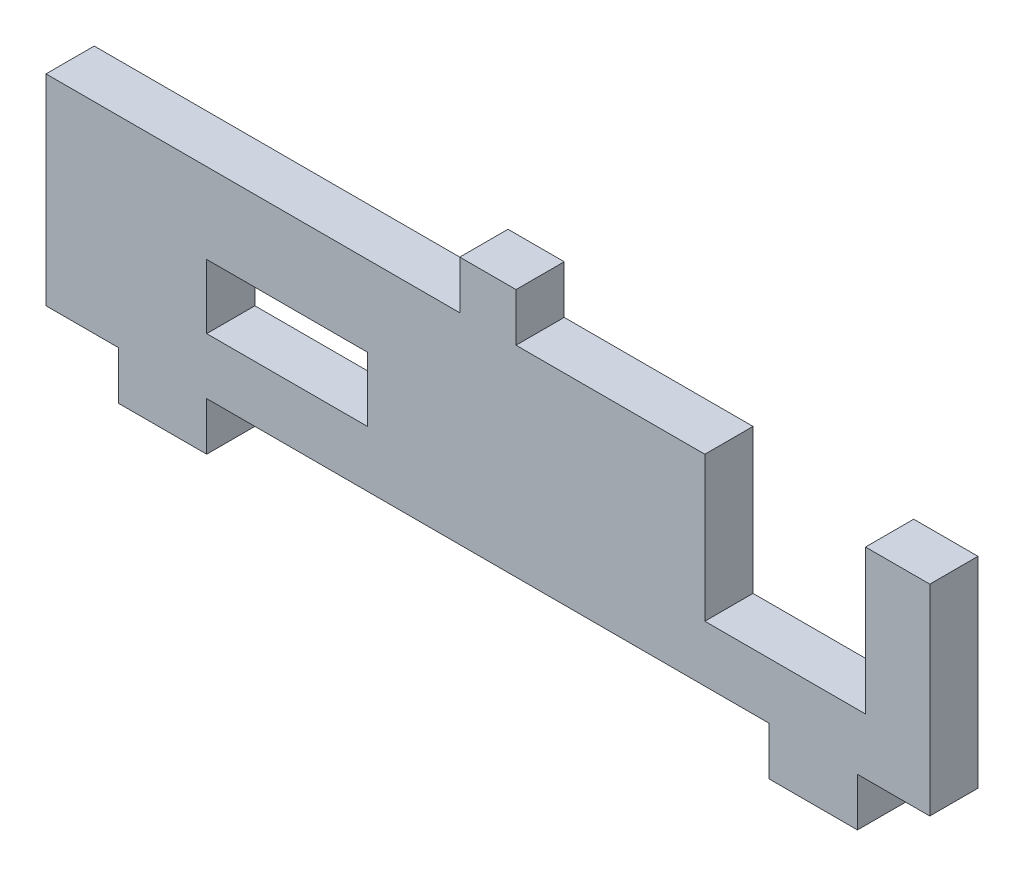
ISO-10303-21;
HEADER;
FILE_DESCRIPTION(('STEP AP214'),'2;1');
FILE_NAME('part.step','',(''),(''),'','','');
FILE_SCHEMA(('AUTOMOTIVE_DESIGN { 1 0 10303 214 1 1 1 1 }'));
ENDSEC;
DATA;
#1=APPLICATION_CONTEXT('core data for automotive mechanical design processes');
#2=APPLICATION_PROTOCOL_DEFINITION('international standard','automotive_design',2000,#1);
#3=PRODUCT_CONTEXT('',#1,'mechanical');
#4=PRODUCT('Part','Part','',(#3));
#5=PRODUCT_RELATED_PRODUCT_CATEGORY('part','',(#4));
#6=PRODUCT_DEFINITION_FORMATION('','',#4);
#7=PRODUCT_DEFINITION_CONTEXT('part definition',#1,'design');
#8=PRODUCT_DEFINITION('design','',#6,#7);
#9=PRODUCT_DEFINITION_SHAPE('','',#8);
#10=(LENGTH_UNIT() NAMED_UNIT(*) SI_UNIT(.MILLI.,.METRE.));
#11=(NAMED_UNIT(*) PLANE_ANGLE_UNIT() SI_UNIT($,.RADIAN.));
#12=(NAMED_UNIT(*) SI_UNIT($,.STERADIAN.) SOLID_ANGLE_UNIT());
#13=UNCERTAINTY_MEASURE_WITH_UNIT(LENGTH_MEASURE(1.E-05),#10,'distance_accuracy_value','');
#14=(GEOMETRIC_REPRESENTATION_CONTEXT(3) GLOBAL_UNCERTAINTY_ASSIGNED_CONTEXT((#13)) GLOBAL_UNIT_ASSIGNED_CONTEXT((#10,
#11,#12)) REPRESENTATION_CONTEXT('',''));
#15=CARTESIAN_POINT('',(0.,0.,0.));
#16=DIRECTION('',(0.,0.,1.));
#17=DIRECTION('',(1.,0.,0.));
#18=AXIS2_PLACEMENT_3D('',#15,#16,#17);
#19=CARTESIAN_POINT('',(0.,0.,3.));
#20=DIRECTION('',(0.,0.,1.));
#21=DIRECTION('',(1.,0.,0.));
#22=AXIS2_PLACEMENT_3D('',#19,#20,#21);
#23=PLANE('',#22);
#24=DIRECTION('',(-1.,0.,0.));
#25=VECTOR('',#24,1.);
#26=CARTESIAN_POINT('',(23.5,6.25,3.));
#27=LINE('',#26,#25);
#28=CARTESIAN_POINT('',(27.5,6.25,3.));
#29=VERTEX_POINT('',#28);
#30=CARTESIAN_POINT('',(23.5,6.25,3.));
#31=VERTEX_POINT('',#30);
#32=EDGE_CURVE('E230',#29,#31,#27,.T.);
#33=ORIENTED_EDGE('',*,*,#32,.T.);
#34=DIRECTION('',(0.,-1.,0.));
#35=VECTOR('',#34,1.);
#36=CARTESIAN_POINT('',(23.5,6.25,3.));
#37=LINE('',#36,#35);
#38=CARTESIAN_POINT('',(23.5,-2.75,3.));
#39=VERTEX_POINT('',#38);
#40=EDGE_CURVE('E233',#31,#39,#37,.T.);
#41=ORIENTED_EDGE('',*,*,#40,.T.);
#42=DIRECTION('',(-1.,0.,0.));
#43=VECTOR('',#42,1.);
#44=CARTESIAN_POINT('',(13.5,-2.75,3.));
#45=LINE('',#44,#43);
#46=CARTESIAN_POINT('',(13.5,-2.75,3.));
#47=VERTEX_POINT('',#46);
#48=EDGE_CURVE('E236',#39,#47,#45,.T.);
#49=ORIENTED_EDGE('',*,*,#48,.T.);
#50=DIRECTION('',(0.,1.,0.));
#51=VECTOR('',#50,1.);
#52=CARTESIAN_POINT('',(13.5,6.25,3.));
#53=LINE('',#52,#51);
#54=CARTESIAN_POINT('',(13.5,6.25,3.));
#55=VERTEX_POINT('',#54);
#56=EDGE_CURVE('E238',#47,#55,#53,.T.);
#57=ORIENTED_EDGE('',*,*,#56,.T.);
#58=DIRECTION('',(-1.,0.,0.));
#59=VECTOR('',#58,1.);
#60=CARTESIAN_POINT('',(1.75,6.25,3.));
#61=LINE('',#60,#59);
#62=CARTESIAN_POINT('',(1.75,6.25,3.));
#63=VERTEX_POINT('',#62);
#64=EDGE_CURVE('E240',#55,#63,#61,.T.);
#65=ORIENTED_EDGE('',*,*,#64,.T.);
#66=DIRECTION('',(0.,1.,0.));
#67=VECTOR('',#66,1.);
#68=CARTESIAN_POINT('',(1.75,6.25,3.));
#69=LINE('',#68,#67);
#70=CARTESIAN_POINT('',(1.75,9.25,3.));
#71=VERTEX_POINT('',#70);
#72=EDGE_CURVE('E242',#63,#71,#69,.T.);
#73=ORIENTED_EDGE('',*,*,#72,.T.);
#74=DIRECTION('',(-1.,0.,0.));
#75=VECTOR('',#74,1.);
#76=CARTESIAN_POINT('',(-1.75,9.25,3.));
#77=LINE('',#76,#75);
#78=CARTESIAN_POINT('',(-1.75,9.25,3.));
#79=VERTEX_POINT('',#78);
#80=EDGE_CURVE('E244',#71,#79,#77,.T.);
#81=ORIENTED_EDGE('',*,*,#80,.T.);
#82=DIRECTION('',(0.,-1.,0.));
#83=VECTOR('',#82,1.);
#84=CARTESIAN_POINT('',(-1.75,6.25,3.));
#85=LINE('',#84,#83);
#86=CARTESIAN_POINT('',(-1.75,6.25,3.));
#87=VERTEX_POINT('',#86);
#88=EDGE_CURVE('E246',#79,#87,#85,.T.);
#89=ORIENTED_EDGE('',*,*,#88,.T.);
#90=DIRECTION('',(-1.,0.,0.));
#91=VECTOR('',#90,1.);
#92=CARTESIAN_POINT('',(-27.5,6.25,3.));
#93=LINE('',#92,#91);
#94=CARTESIAN_POINT('',(-27.5,6.25,3.));
#95=VERTEX_POINT('',#94);
#96=EDGE_CURVE('E248',#87,#95,#93,.T.);
#97=ORIENTED_EDGE('',*,*,#96,.T.);
#98=DIRECTION('',(0.,-1.,0.));
#99=VECTOR('',#98,1.);
#100=CARTESIAN_POINT('',(-27.5,-6.25,3.));
#101=LINE('',#100,#99);
#102=CARTESIAN_POINT('',(-27.5,-6.25,3.));
#103=VERTEX_POINT('',#102);
#104=EDGE_CURVE('E250',#95,#103,#101,.T.);
#105=ORIENTED_EDGE('',*,*,#104,.T.);
#106=DIRECTION('',(1.,0.,0.));
#107=VECTOR('',#106,1.);
#108=CARTESIAN_POINT('',(-27.5,-6.25,3.));
#109=LINE('',#108,#107);
#110=CARTESIAN_POINT('',(-23.,-6.25,3.));
#111=VERTEX_POINT('',#110);
#112=EDGE_CURVE('E252',#103,#111,#109,.T.);
#113=ORIENTED_EDGE('',*,*,#112,.T.);
#114=DIRECTION('',(0.,-1.,0.));
#115=VECTOR('',#114,1.);
#116=CARTESIAN_POINT('',(-23.,-6.25,3.));
#117=LINE('',#116,#115);
#118=CARTESIAN_POINT('',(-23.,-9.25,3.));
#119=VERTEX_POINT('',#118);
#120=EDGE_CURVE('E254',#111,#119,#117,.T.);
#121=ORIENTED_EDGE('',*,*,#120,.T.);
#122=DIRECTION('',(1.,0.,0.));
#123=VECTOR('',#122,1.);
#124=CARTESIAN_POINT('',(-23.,-9.25,3.));
#125=LINE('',#124,#123);
#126=CARTESIAN_POINT('',(-17.5,-9.25,3.));
#127=VERTEX_POINT('',#126);
#128=EDGE_CURVE('E256',#119,#127,#125,.T.);
#129=ORIENTED_EDGE('',*,*,#128,.T.);
#130=DIRECTION('',(0.,1.,0.));
#131=VECTOR('',#130,1.);
#132=CARTESIAN_POINT('',(-17.5,-6.25,3.));
#133=LINE('',#132,#131);
#134=CARTESIAN_POINT('',(-17.5,-6.25,3.));
#135=VERTEX_POINT('',#134);
#136=EDGE_CURVE('E258',#127,#135,#133,.T.);
#137=ORIENTED_EDGE('',*,*,#136,.T.);
#138=DIRECTION('',(1.,0.,0.));
#139=VECTOR('',#138,1.);
#140=CARTESIAN_POINT('',(-17.5,-6.25,3.));
#141=LINE('',#140,#139);
#142=CARTESIAN_POINT('',(17.5,-6.25,3.));
#143=VERTEX_POINT('',#142);
#144=EDGE_CURVE('E260',#135,#143,#141,.T.);
#145=ORIENTED_EDGE('',*,*,#144,.T.);
#146=DIRECTION('',(0.,-1.,0.));
#147=VECTOR('',#146,1.);
#148=CARTESIAN_POINT('',(17.5,-6.25,3.));
#149=LINE('',#148,#147);
#150=CARTESIAN_POINT('',(17.5,-9.25,3.));
#151=VERTEX_POINT('',#150);
#152=EDGE_CURVE('E262',#143,#151,#149,.T.);
#153=ORIENTED_EDGE('',*,*,#152,.T.);
#154=DIRECTION('',(1.,0.,0.));
#155=VECTOR('',#154,1.);
#156=CARTESIAN_POINT('',(17.5,-9.25,3.));
#157=LINE('',#156,#155);
#158=CARTESIAN_POINT('',(23.,-9.25,3.));
#159=VERTEX_POINT('',#158);
#160=EDGE_CURVE('E264',#151,#159,#157,.T.);
#161=ORIENTED_EDGE('',*,*,#160,.T.);
#162=DIRECTION('',(0.,1.,0.));
#163=VECTOR('',#162,1.);
#164=CARTESIAN_POINT('',(23.,-6.25,3.));
#165=LINE('',#164,#163);
#166=CARTESIAN_POINT('',(23.,-6.25,3.));
#167=VERTEX_POINT('',#166);
#168=EDGE_CURVE('E266',#159,#167,#165,.T.);
#169=ORIENTED_EDGE('',*,*,#168,.T.);
#170=DIRECTION('',(1.,0.,0.));
#171=VECTOR('',#170,1.);
#172=CARTESIAN_POINT('',(23.,-6.25,3.));
#173=LINE('',#172,#171);
#174=CARTESIAN_POINT('',(27.5,-6.25,3.));
#175=VERTEX_POINT('',#174);
#176=EDGE_CURVE('E268',#167,#175,#173,.T.);
#177=ORIENTED_EDGE('',*,*,#176,.T.);
#178=DIRECTION('',(0.,1.,0.));
#179=VECTOR('',#178,1.);
#180=CARTESIAN_POINT('',(27.5,-6.25,3.));
#181=LINE('',#180,#179);
#182=EDGE_CURVE('E270',#175,#29,#181,.T.);
#183=ORIENTED_EDGE('',*,*,#182,.T.);
#184=EDGE_LOOP('',(#33,#41,#49,#57,#65,#73,#81,#89,#97,#105,#113,#121,#129,#137,#145,#153,#161,
#169,#177,#183));
#185=FACE_BOUND('',#184,.T.);
#186=DIRECTION('',(1.,0.,0.));
#187=VECTOR('',#186,1.);
#188=CARTESIAN_POINT('',(-17.5,-2.75,3.));
#189=LINE('',#188,#187);
#190=CARTESIAN_POINT('',(-17.5,-2.75,3.));
#191=VERTEX_POINT('',#190);
#192=CARTESIAN_POINT('',(-7.49999999999999,-2.75,3.));
#193=VERTEX_POINT('',#192);
#194=EDGE_CURVE('E202',#191,#193,#189,.T.);
#195=ORIENTED_EDGE('',*,*,#194,.F.);
#196=DIRECTION('',(0.,-1.,0.));
#197=VECTOR('',#196,1.);
#198=CARTESIAN_POINT('',(-17.5,1.25,3.));
#199=LINE('',#198,#197);
#200=CARTESIAN_POINT('',(-17.5,1.25,3.));
#201=VERTEX_POINT('',#200);
#202=EDGE_CURVE('E194',#201,#191,#199,.T.);
#203=ORIENTED_EDGE('',*,*,#202,.F.);
#204=DIRECTION('',(-1.,0.,0.));
#205=VECTOR('',#204,1.);
#206=CARTESIAN_POINT('',(-17.5,1.25,3.));
#207=LINE('',#206,#205);
#208=CARTESIAN_POINT('',(-7.49999999999999,1.25,3.));
#209=VERTEX_POINT('',#208);
#210=EDGE_CURVE('E216',#209,#201,#207,.T.);
#211=ORIENTED_EDGE('',*,*,#210,.F.);
#212=DIRECTION('',(0.,1.,0.));
#213=VECTOR('',#212,1.);
#214=CARTESIAN_POINT('',(-7.49999999999999,1.25,3.));
#215=LINE('',#214,#213);
#216=EDGE_CURVE('E214',#193,#209,#215,.T.);
#217=ORIENTED_EDGE('',*,*,#216,.F.);
#218=EDGE_LOOP('',(#195,#203,#211,#217));
#219=FACE_BOUND('',#218,.T.);
#220=ADVANCED_FACE('F33',(#185,#219),#23,.T.);
#221=CARTESIAN_POINT('',(0.,0.,0.));
#222=DIRECTION('',(0.,0.,1.));
#223=DIRECTION('',(1.,0.,0.));
#224=AXIS2_PLACEMENT_3D('',#221,#222,#223);
#225=PLANE('',#224);
#226=DIRECTION('',(-1.,0.,0.));
#227=VECTOR('',#226,1.);
#228=CARTESIAN_POINT('',(23.5,6.25,0.));
#229=LINE('',#228,#227);
#230=CARTESIAN_POINT('',(27.5,6.25,0.));
#231=VERTEX_POINT('',#230);
#232=CARTESIAN_POINT('',(23.5,6.25,0.));
#233=VERTEX_POINT('',#232);
#234=EDGE_CURVE('E210',#231,#233,#229,.T.);
#235=ORIENTED_EDGE('',*,*,#234,.F.);
#236=DIRECTION('',(0.,1.,0.));
#237=VECTOR('',#236,1.);
#238=CARTESIAN_POINT('',(27.5,-6.25,0.));
#239=LINE('',#238,#237);
#240=CARTESIAN_POINT('',(27.5,-6.25,0.));
#241=VERTEX_POINT('',#240);
#242=EDGE_CURVE('E234',#241,#231,#239,.T.);
#243=ORIENTED_EDGE('',*,*,#242,.F.);
#244=DIRECTION('',(1.,0.,0.));
#245=VECTOR('',#244,1.);
#246=CARTESIAN_POINT('',(23.,-6.25,0.));
#247=LINE('',#246,#245);
#248=CARTESIAN_POINT('',(23.,-6.25,0.));
#249=VERTEX_POINT('',#248);
#250=EDGE_CURVE('E309',#249,#241,#247,.T.);
#251=ORIENTED_EDGE('',*,*,#250,.F.);
#252=DIRECTION('',(0.,1.,0.));
#253=VECTOR('',#252,1.);
#254=CARTESIAN_POINT('',(23.,-6.25,0.));
#255=LINE('',#254,#253);
#256=CARTESIAN_POINT('',(23.,-9.25,0.));
#257=VERTEX_POINT('',#256);
#258=EDGE_CURVE('E307',#257,#249,#255,.T.);
#259=ORIENTED_EDGE('',*,*,#258,.F.);
#260=DIRECTION('',(1.,0.,0.));
#261=VECTOR('',#260,1.);
#262=CARTESIAN_POINT('',(17.5,-9.25,0.));
#263=LINE('',#262,#261);
#264=CARTESIAN_POINT('',(17.5,-9.25,0.));
#265=VERTEX_POINT('',#264);
#266=EDGE_CURVE('E305',#265,#257,#263,.T.);
#267=ORIENTED_EDGE('',*,*,#266,.F.);
#268=DIRECTION('',(0.,-1.,0.));
#269=VECTOR('',#268,1.);
#270=CARTESIAN_POINT('',(17.5,-6.25,0.));
#271=LINE('',#270,#269);
#272=CARTESIAN_POINT('',(17.5,-6.25,0.));
#273=VERTEX_POINT('',#272);
#274=EDGE_CURVE('E303',#273,#265,#271,.T.);
#275=ORIENTED_EDGE('',*,*,#274,.F.);
#276=DIRECTION('',(1.,0.,0.));
#277=VECTOR('',#276,1.);
#278=CARTESIAN_POINT('',(-17.5,-6.25,0.));
#279=LINE('',#278,#277);
#280=CARTESIAN_POINT('',(-17.5,-6.25,0.));
#281=VERTEX_POINT('',#280);
#282=EDGE_CURVE('E301',#281,#273,#279,.T.);
#283=ORIENTED_EDGE('',*,*,#282,.F.);
#284=DIRECTION('',(0.,1.,0.));
#285=VECTOR('',#284,1.);
#286=CARTESIAN_POINT('',(-17.5,-6.25,0.));
#287=LINE('',#286,#285);
#288=CARTESIAN_POINT('',(-17.5,-9.25,0.));
#289=VERTEX_POINT('',#288);
#290=EDGE_CURVE('E299',#289,#281,#287,.T.);
#291=ORIENTED_EDGE('',*,*,#290,.F.);
#292=DIRECTION('',(1.,0.,0.));
#293=VECTOR('',#292,1.);
#294=CARTESIAN_POINT('',(-23.,-9.25,0.));
#295=LINE('',#294,#293);
#296=CARTESIAN_POINT('',(-23.,-9.25,0.));
#297=VERTEX_POINT('',#296);
#298=EDGE_CURVE('E297',#297,#289,#295,.T.);
#299=ORIENTED_EDGE('',*,*,#298,.F.);
#300=DIRECTION('',(0.,-1.,0.));
#301=VECTOR('',#300,1.);
#302=CARTESIAN_POINT('',(-23.,-6.25,0.));
#303=LINE('',#302,#301);
#304=CARTESIAN_POINT('',(-23.,-6.25,0.));
#305=VERTEX_POINT('',#304);
#306=EDGE_CURVE('E295',#305,#297,#303,.T.);
#307=ORIENTED_EDGE('',*,*,#306,.F.);
#308=DIRECTION('',(1.,0.,0.));
#309=VECTOR('',#308,1.);
#310=CARTESIAN_POINT('',(-27.5,-6.25,0.));
#311=LINE('',#310,#309);
#312=CARTESIAN_POINT('',(-27.5,-6.25,0.));
#313=VERTEX_POINT('',#312);
#314=EDGE_CURVE('E293',#313,#305,#311,.T.);
#315=ORIENTED_EDGE('',*,*,#314,.F.);
#316=DIRECTION('',(0.,-1.,0.));
#317=VECTOR('',#316,1.);
#318=CARTESIAN_POINT('',(-27.5,-6.25,0.));
#319=LINE('',#318,#317);
#320=CARTESIAN_POINT('',(-27.5,6.25,0.));
#321=VERTEX_POINT('',#320);
#322=EDGE_CURVE('E291',#321,#313,#319,.T.);
#323=ORIENTED_EDGE('',*,*,#322,.F.);
#324=DIRECTION('',(-1.,0.,0.));
#325=VECTOR('',#324,1.);
#326=CARTESIAN_POINT('',(-27.5,6.25,0.));
#327=LINE('',#326,#325);
#328=CARTESIAN_POINT('',(-1.75,6.25,0.));
#329=VERTEX_POINT('',#328);
#330=EDGE_CURVE('E289',#329,#321,#327,.T.);
#331=ORIENTED_EDGE('',*,*,#330,.F.);
#332=DIRECTION('',(0.,-1.,0.));
#333=VECTOR('',#332,1.);
#334=CARTESIAN_POINT('',(-1.75,6.25,0.));
#335=LINE('',#334,#333);
#336=CARTESIAN_POINT('',(-1.75,9.25,0.));
#337=VERTEX_POINT('',#336);
#338=EDGE_CURVE('E287',#337,#329,#335,.T.);
#339=ORIENTED_EDGE('',*,*,#338,.F.);
#340=DIRECTION('',(-1.,0.,0.));
#341=VECTOR('',#340,1.);
#342=CARTESIAN_POINT('',(-1.75,9.25,0.));
#343=LINE('',#342,#341);
#344=CARTESIAN_POINT('',(1.75,9.25,0.));
#345=VERTEX_POINT('',#344);
#346=EDGE_CURVE('E285',#345,#337,#343,.T.);
#347=ORIENTED_EDGE('',*,*,#346,.F.);
#348=DIRECTION('',(0.,1.,0.));
#349=VECTOR('',#348,1.);
#350=CARTESIAN_POINT('',(1.75,6.25,0.));
#351=LINE('',#350,#349);
#352=CARTESIAN_POINT('',(1.75,6.25,0.));
#353=VERTEX_POINT('',#352);
#354=EDGE_CURVE('E283',#353,#345,#351,.T.);
#355=ORIENTED_EDGE('',*,*,#354,.F.);
#356=DIRECTION('',(-1.,0.,0.));
#357=VECTOR('',#356,1.);
#358=CARTESIAN_POINT('',(1.75,6.25,0.));
#359=LINE('',#358,#357);
#360=CARTESIAN_POINT('',(13.5,6.25,0.));
#361=VERTEX_POINT('',#360);
#362=EDGE_CURVE('E281',#361,#353,#359,.T.);
#363=ORIENTED_EDGE('',*,*,#362,.F.);
#364=DIRECTION('',(0.,1.,0.));
#365=VECTOR('',#364,1.);
#366=CARTESIAN_POINT('',(13.5,6.25,0.));
#367=LINE('',#366,#365);
#368=CARTESIAN_POINT('',(13.5,-2.75,0.));
#369=VERTEX_POINT('',#368);
#370=EDGE_CURVE('E279',#369,#361,#367,.T.);
#371=ORIENTED_EDGE('',*,*,#370,.F.);
#372=DIRECTION('',(-1.,0.,0.));
#373=VECTOR('',#372,1.);
#374=CARTESIAN_POINT('',(13.5,-2.75,0.));
#375=LINE('',#374,#373);
#376=CARTESIAN_POINT('',(23.5,-2.75,0.));
#377=VERTEX_POINT('',#376);
#378=EDGE_CURVE('E277',#377,#369,#375,.T.);
#379=ORIENTED_EDGE('',*,*,#378,.F.);
#380=DIRECTION('',(0.,-1.,0.));
#381=VECTOR('',#380,1.);
#382=CARTESIAN_POINT('',(23.5,6.25,0.));
#383=LINE('',#382,#381);
#384=EDGE_CURVE('E275',#233,#377,#383,.T.);
#385=ORIENTED_EDGE('',*,*,#384,.F.);
#386=EDGE_LOOP('',(#235,#243,#251,#259,#267,#275,#283,#291,#299,#307,#315,#323,#331,#339,#347,
#355,#363,#371,#379,#385));
#387=FACE_BOUND('',#386,.T.);
#388=DIRECTION('',(0.,-1.,0.));
#389=VECTOR('',#388,1.);
#390=CARTESIAN_POINT('',(-17.5,1.25,0.));
#391=LINE('',#390,#389);
#392=CARTESIAN_POINT('',(-17.5,1.25,0.));
#393=VERTEX_POINT('',#392);
#394=CARTESIAN_POINT('',(-17.5,-2.75,0.));
#395=VERTEX_POINT('',#394);
#396=EDGE_CURVE('E56',#393,#395,#391,.T.);
#397=ORIENTED_EDGE('',*,*,#396,.T.);
#398=DIRECTION('',(1.,0.,0.));
#399=VECTOR('',#398,1.);
#400=CARTESIAN_POINT('',(-17.5,-2.75,0.));
#401=LINE('',#400,#399);
#402=CARTESIAN_POINT('',(-7.49999999999999,-2.75,0.));
#403=VERTEX_POINT('',#402);
#404=EDGE_CURVE('E209',#395,#403,#401,.T.);
#405=ORIENTED_EDGE('',*,*,#404,.T.);
#406=DIRECTION('',(0.,1.,0.));
#407=VECTOR('',#406,1.);
#408=CARTESIAN_POINT('',(-7.49999999999999,1.25,0.));
#409=LINE('',#408,#407);
#410=CARTESIAN_POINT('',(-7.49999999999999,1.25,0.));
#411=VERTEX_POINT('',#410);
#412=EDGE_CURVE('E222',#403,#411,#409,.T.);
#413=ORIENTED_EDGE('',*,*,#412,.T.);
#414=DIRECTION('',(-1.,0.,0.));
#415=VECTOR('',#414,1.);
#416=CARTESIAN_POINT('',(-17.5,1.25,0.));
#417=LINE('',#416,#415);
#418=EDGE_CURVE('E203',#411,#393,#417,.T.);
#419=ORIENTED_EDGE('',*,*,#418,.T.);
#420=EDGE_LOOP('',(#397,#405,#413,#419));
#421=FACE_BOUND('',#420,.T.);
#422=ADVANCED_FACE('F375',(#387,#421),#225,.F.);
#423=CARTESIAN_POINT('',(23.5,6.25,3.));
#424=DIRECTION('',(0.,-1.,0.));
#425=DIRECTION('',(0.,0.,-1.));
#426=AXIS2_PLACEMENT_3D('',#423,#424,#425);
#427=PLANE('',#426);
#428=ORIENTED_EDGE('',*,*,#234,.T.);
#429=DIRECTION('',(0.,0.,-1.));
#430=VECTOR('',#429,1.);
#431=CARTESIAN_POINT('',(23.5,6.25,3.));
#432=LINE('',#431,#430);
#433=EDGE_CURVE('E11',#31,#233,#432,.T.);
#434=ORIENTED_EDGE('',*,*,#433,.F.);
#435=ORIENTED_EDGE('',*,*,#32,.F.);
#436=DIRECTION('',(0.,0.,-1.));
#437=VECTOR('',#436,1.);
#438=CARTESIAN_POINT('',(27.5,6.25,3.));
#439=LINE('',#438,#437);
#440=EDGE_CURVE('E272',#29,#231,#439,.T.);
#441=ORIENTED_EDGE('',*,*,#440,.T.);
#442=EDGE_LOOP('',(#428,#434,#435,#441));
#443=FACE_BOUND('',#442,.T.);
#444=ADVANCED_FACE('F35',(#443),#427,.F.);
#445=CARTESIAN_POINT('',(23.5,6.25,3.));
#446=DIRECTION('',(1.,0.,0.));
#447=DIRECTION('',(0.,0.,-1.));
#448=AXIS2_PLACEMENT_3D('',#445,#446,#447);
#449=PLANE('',#448);
#450=ORIENTED_EDGE('',*,*,#384,.T.);
#451=DIRECTION('',(0.,0.,-1.));
#452=VECTOR('',#451,1.);
#453=CARTESIAN_POINT('',(23.5,-2.75,3.));
#454=LINE('',#453,#452);
#455=EDGE_CURVE('E41',#39,#377,#454,.T.);
#456=ORIENTED_EDGE('',*,*,#455,.F.);
#457=ORIENTED_EDGE('',*,*,#40,.F.);
#458=ORIENTED_EDGE('',*,*,#433,.T.);
#459=EDGE_LOOP('',(#450,#456,#457,#458));
#460=FACE_BOUND('',#459,.T.);
#461=ADVANCED_FACE('F392',(#460),#449,.F.);
#462=CARTESIAN_POINT('',(13.5,-2.75,3.));
#463=DIRECTION('',(0.,-1.,0.));
#464=DIRECTION('',(1.,0.,0.));
#465=AXIS2_PLACEMENT_3D('',#462,#463,#464);
#466=PLANE('',#465);
#467=ORIENTED_EDGE('',*,*,#378,.T.);
#468=DIRECTION('',(0.,0.,-1.));
#469=VECTOR('',#468,1.);
#470=CARTESIAN_POINT('',(13.5,-2.75,3.));
#471=LINE('',#470,#469);
#472=EDGE_CURVE('E362',#47,#369,#471,.T.);
#473=ORIENTED_EDGE('',*,*,#472,.F.);
#474=ORIENTED_EDGE('',*,*,#48,.F.);
#475=ORIENTED_EDGE('',*,*,#455,.T.);
#476=EDGE_LOOP('',(#467,#473,#474,#475));
#477=FACE_BOUND('',#476,.T.);
#478=ADVANCED_FACE('F369',(#477),#466,.F.);
#479=CARTESIAN_POINT('',(13.5,6.25,3.));
#480=DIRECTION('',(-1.,0.,0.));
#481=DIRECTION('',(0.,0.,1.));
#482=AXIS2_PLACEMENT_3D('',#479,#480,#481);
#483=PLANE('',#482);
#484=ORIENTED_EDGE('',*,*,#370,.T.);
#485=DIRECTION('',(0.,0.,-1.));
#486=VECTOR('',#485,1.);
#487=CARTESIAN_POINT('',(13.5,6.25,3.));
#488=LINE('',#487,#486);
#489=EDGE_CURVE('E359',#55,#361,#488,.T.);
#490=ORIENTED_EDGE('',*,*,#489,.F.);
#491=ORIENTED_EDGE('',*,*,#56,.F.);
#492=ORIENTED_EDGE('',*,*,#472,.T.);
#493=EDGE_LOOP('',(#484,#490,#491,#492));
#494=FACE_BOUND('',#493,.T.);
#495=ADVANCED_FACE('F381',(#494),#483,.F.);
#496=CARTESIAN_POINT('',(1.75,6.25,3.));
#497=DIRECTION('',(0.,-1.,0.));
#498=DIRECTION('',(0.,0.,-1.));
#499=AXIS2_PLACEMENT_3D('',#496,#497,#498);
#500=PLANE('',#499);
#501=ORIENTED_EDGE('',*,*,#362,.T.);
#502=DIRECTION('',(0.,0.,-1.));
#503=VECTOR('',#502,1.);
#504=CARTESIAN_POINT('',(1.75,6.25,3.));
#505=LINE('',#504,#503);
#506=EDGE_CURVE('E356',#63,#353,#505,.T.);
#507=ORIENTED_EDGE('',*,*,#506,.F.);
#508=ORIENTED_EDGE('',*,*,#64,.F.);
#509=ORIENTED_EDGE('',*,*,#489,.T.);
#510=EDGE_LOOP('',(#501,#507,#508,#509));
#511=FACE_BOUND('',#510,.T.);
#512=ADVANCED_FACE('F385',(#511),#500,.F.);
#513=CARTESIAN_POINT('',(1.75,6.25,3.));
#514=DIRECTION('',(-1.,0.,0.));
#515=DIRECTION('',(0.,0.,1.));
#516=AXIS2_PLACEMENT_3D('',#513,#514,#515);
#517=PLANE('',#516);
#518=ORIENTED_EDGE('',*,*,#354,.T.);
#519=DIRECTION('',(0.,0.,-1.));
#520=VECTOR('',#519,1.);
#521=CARTESIAN_POINT('',(1.75,9.25,3.));
#522=LINE('',#521,#520);
#523=EDGE_CURVE('E353',#71,#345,#522,.T.);
#524=ORIENTED_EDGE('',*,*,#523,.F.);
#525=ORIENTED_EDGE('',*,*,#72,.F.);
#526=ORIENTED_EDGE('',*,*,#506,.T.);
#527=EDGE_LOOP('',(#518,#524,#525,#526));
#528=FACE_BOUND('',#527,.T.);
#529=ADVANCED_FACE('F465',(#528),#517,.F.);
#530=CARTESIAN_POINT('',(-1.75,9.25,3.));
#531=DIRECTION('',(0.,-1.,0.));
#532=DIRECTION('',(0.,0.,-1.));
#533=AXIS2_PLACEMENT_3D('',#530,#531,#532);
#534=PLANE('',#533);
#535=ORIENTED_EDGE('',*,*,#346,.T.);
#536=DIRECTION('',(0.,0.,-1.));
#537=VECTOR('',#536,1.);
#538=CARTESIAN_POINT('',(-1.75,9.25,3.));
#539=LINE('',#538,#537);
#540=EDGE_CURVE('E350',#79,#337,#539,.T.);
#541=ORIENTED_EDGE('',*,*,#540,.F.);
#542=ORIENTED_EDGE('',*,*,#80,.F.);
#543=ORIENTED_EDGE('',*,*,#523,.T.);
#544=EDGE_LOOP('',(#535,#541,#542,#543));
#545=FACE_BOUND('',#544,.T.);
#546=ADVANCED_FACE('F463',(#545),#534,.F.);
#547=CARTESIAN_POINT('',(-1.75,6.25,3.));
#548=DIRECTION('',(1.,0.,0.));
#549=DIRECTION('',(0.,0.,-1.));
#550=AXIS2_PLACEMENT_3D('',#547,#548,#549);
#551=PLANE('',#550);
#552=ORIENTED_EDGE('',*,*,#338,.T.);
#553=DIRECTION('',(0.,0.,-1.));
#554=VECTOR('',#553,1.);
#555=CARTESIAN_POINT('',(-1.75,6.25,3.));
#556=LINE('',#555,#554);
#557=EDGE_CURVE('E347',#87,#329,#556,.T.);
#558=ORIENTED_EDGE('',*,*,#557,.F.);
#559=ORIENTED_EDGE('',*,*,#88,.F.);
#560=ORIENTED_EDGE('',*,*,#540,.T.);
#561=EDGE_LOOP('',(#552,#558,#559,#560));
#562=FACE_BOUND('',#561,.T.);
#563=ADVANCED_FACE('F458',(#562),#551,.F.);
#564=CARTESIAN_POINT('',(-27.5,6.25,3.));
#565=DIRECTION('',(0.,-1.,0.));
#566=DIRECTION('',(0.,0.,-1.));
#567=AXIS2_PLACEMENT_3D('',#564,#565,#566);
#568=PLANE('',#567);
#569=ORIENTED_EDGE('',*,*,#330,.T.);
#570=DIRECTION('',(0.,0.,-1.));
#571=VECTOR('',#570,1.);
#572=CARTESIAN_POINT('',(-27.5,6.25,3.));
#573=LINE('',#572,#571);
#574=EDGE_CURVE('E344',#95,#321,#573,.T.);
#575=ORIENTED_EDGE('',*,*,#574,.F.);
#576=ORIENTED_EDGE('',*,*,#96,.F.);
#577=ORIENTED_EDGE('',*,*,#557,.T.);
#578=EDGE_LOOP('',(#569,#575,#576,#577));
#579=FACE_BOUND('',#578,.T.);
#580=ADVANCED_FACE('F453',(#579),#568,.F.);
#581=CARTESIAN_POINT('',(-27.5,-6.25,3.));
#582=DIRECTION('',(1.,0.,0.));
#583=DIRECTION('',(0.,0.,-1.));
#584=AXIS2_PLACEMENT_3D('',#581,#582,#583);
#585=PLANE('',#584);
#586=ORIENTED_EDGE('',*,*,#322,.T.);
#587=DIRECTION('',(0.,0.,-1.));
#588=VECTOR('',#587,1.);
#589=CARTESIAN_POINT('',(-27.5,-6.25,3.));
#590=LINE('',#589,#588);
#591=EDGE_CURVE('E341',#103,#313,#590,.T.);
#592=ORIENTED_EDGE('',*,*,#591,.F.);
#593=ORIENTED_EDGE('',*,*,#104,.F.);
#594=ORIENTED_EDGE('',*,*,#574,.T.);
#595=EDGE_LOOP('',(#586,#592,#593,#594));
#596=FACE_BOUND('',#595,.T.);
#597=ADVANCED_FACE('F449',(#596),#585,.F.);
#598=CARTESIAN_POINT('',(-27.5,-6.25,3.));
#599=DIRECTION('',(0.,1.,0.));
#600=DIRECTION('',(0.,0.,1.));
#601=AXIS2_PLACEMENT_3D('',#598,#599,#600);
#602=PLANE('',#601);
#603=ORIENTED_EDGE('',*,*,#314,.T.);
#604=DIRECTION('',(0.,0.,-1.));
#605=VECTOR('',#604,1.);
#606=CARTESIAN_POINT('',(-23.,-6.25,3.));
#607=LINE('',#606,#605);
#608=EDGE_CURVE('E338',#111,#305,#607,.T.);
#609=ORIENTED_EDGE('',*,*,#608,.F.);
#610=ORIENTED_EDGE('',*,*,#112,.F.);
#611=ORIENTED_EDGE('',*,*,#591,.T.);
#612=EDGE_LOOP('',(#603,#609,#610,#611));
#613=FACE_BOUND('',#612,.T.);
#614=ADVANCED_FACE('F444',(#613),#602,.F.);
#615=CARTESIAN_POINT('',(-23.,-6.25,3.));
#616=DIRECTION('',(1.,0.,0.));
#617=DIRECTION('',(0.,1.,0.));
#618=AXIS2_PLACEMENT_3D('',#615,#616,#617);
#619=PLANE('',#618);
#620=ORIENTED_EDGE('',*,*,#306,.T.);
#621=DIRECTION('',(0.,0.,-1.));
#622=VECTOR('',#621,1.);
#623=CARTESIAN_POINT('',(-23.,-9.25,3.));
#624=LINE('',#623,#622);
#625=EDGE_CURVE('E335',#119,#297,#624,.T.);
#626=ORIENTED_EDGE('',*,*,#625,.F.);
#627=ORIENTED_EDGE('',*,*,#120,.F.);
#628=ORIENTED_EDGE('',*,*,#608,.T.);
#629=EDGE_LOOP('',(#620,#626,#627,#628));
#630=FACE_BOUND('',#629,.T.);
#631=ADVANCED_FACE('F438',(#630),#619,.F.);
#632=CARTESIAN_POINT('',(-23.,-9.25,3.));
#633=DIRECTION('',(0.,1.,0.));
#634=DIRECTION('',(0.,0.,1.));
#635=AXIS2_PLACEMENT_3D('',#632,#633,#634);
#636=PLANE('',#635);
#637=ORIENTED_EDGE('',*,*,#298,.T.);
#638=DIRECTION('',(0.,0.,-1.));
#639=VECTOR('',#638,1.);
#640=CARTESIAN_POINT('',(-17.5,-9.25,3.));
#641=LINE('',#640,#639);
#642=EDGE_CURVE('E332',#127,#289,#641,.T.);
#643=ORIENTED_EDGE('',*,*,#642,.F.);
#644=ORIENTED_EDGE('',*,*,#128,.F.);
#645=ORIENTED_EDGE('',*,*,#625,.T.);
#646=EDGE_LOOP('',(#637,#643,#644,#645));
#647=FACE_BOUND('',#646,.T.);
#648=ADVANCED_FACE('F434',(#647),#636,.F.);
#649=CARTESIAN_POINT('',(-17.5,-6.25,3.));
#650=DIRECTION('',(-1.,0.,0.));
#651=DIRECTION('',(0.,0.,1.));
#652=AXIS2_PLACEMENT_3D('',#649,#650,#651);
#653=PLANE('',#652);
#654=ORIENTED_EDGE('',*,*,#290,.T.);
#655=DIRECTION('',(0.,0.,-1.));
#656=VECTOR('',#655,1.);
#657=CARTESIAN_POINT('',(-17.5,-6.25,3.));
#658=LINE('',#657,#656);
#659=EDGE_CURVE('E329',#135,#281,#658,.T.);
#660=ORIENTED_EDGE('',*,*,#659,.F.);
#661=ORIENTED_EDGE('',*,*,#136,.F.);
#662=ORIENTED_EDGE('',*,*,#642,.T.);
#663=EDGE_LOOP('',(#654,#660,#661,#662));
#664=FACE_BOUND('',#663,.T.);
#665=ADVANCED_FACE('F429',(#664),#653,.F.);
#666=CARTESIAN_POINT('',(-17.5,-6.25,3.));
#667=DIRECTION('',(0.,1.,0.));
#668=DIRECTION('',(0.,0.,1.));
#669=AXIS2_PLACEMENT_3D('',#666,#667,#668);
#670=PLANE('',#669);
#671=ORIENTED_EDGE('',*,*,#282,.T.);
#672=DIRECTION('',(0.,0.,-1.));
#673=VECTOR('',#672,1.);
#674=CARTESIAN_POINT('',(17.5,-6.25,3.));
#675=LINE('',#674,#673);
#676=EDGE_CURVE('E326',#143,#273,#675,.T.);
#677=ORIENTED_EDGE('',*,*,#676,.F.);
#678=ORIENTED_EDGE('',*,*,#144,.F.);
#679=ORIENTED_EDGE('',*,*,#659,.T.);
#680=EDGE_LOOP('',(#671,#677,#678,#679));
#681=FACE_BOUND('',#680,.T.);
#682=ADVANCED_FACE('F423',(#681),#670,.F.);
#683=CARTESIAN_POINT('',(17.5,-6.25,3.));
#684=DIRECTION('',(1.,0.,0.));
#685=DIRECTION('',(0.,0.,-1.));
#686=AXIS2_PLACEMENT_3D('',#683,#684,#685);
#687=PLANE('',#686);
#688=ORIENTED_EDGE('',*,*,#274,.T.);
#689=DIRECTION('',(0.,0.,-1.));
#690=VECTOR('',#689,1.);
#691=CARTESIAN_POINT('',(17.5,-9.25,3.));
#692=LINE('',#691,#690);
#693=EDGE_CURVE('E323',#151,#265,#692,.T.);
#694=ORIENTED_EDGE('',*,*,#693,.F.);
#695=ORIENTED_EDGE('',*,*,#152,.F.);
#696=ORIENTED_EDGE('',*,*,#676,.T.);
#697=EDGE_LOOP('',(#688,#694,#695,#696));
#698=FACE_BOUND('',#697,.T.);
#699=ADVANCED_FACE('F419',(#698),#687,.F.);
#700=CARTESIAN_POINT('',(17.5,-9.25,3.));
#701=DIRECTION('',(0.,1.,0.));
#702=DIRECTION('',(0.,0.,1.));
#703=AXIS2_PLACEMENT_3D('',#700,#701,#702);
#704=PLANE('',#703);
#705=ORIENTED_EDGE('',*,*,#266,.T.);
#706=DIRECTION('',(0.,0.,-1.));
#707=VECTOR('',#706,1.);
#708=CARTESIAN_POINT('',(23.,-9.25,3.));
#709=LINE('',#708,#707);
#710=EDGE_CURVE('E320',#159,#257,#709,.T.);
#711=ORIENTED_EDGE('',*,*,#710,.F.);
#712=ORIENTED_EDGE('',*,*,#160,.F.);
#713=ORIENTED_EDGE('',*,*,#693,.T.);
#714=EDGE_LOOP('',(#705,#711,#712,#713));
#715=FACE_BOUND('',#714,.T.);
#716=ADVANCED_FACE('F414',(#715),#704,.F.);
#717=CARTESIAN_POINT('',(23.,-6.25,3.));
#718=DIRECTION('',(-1.,0.,0.));
#719=DIRECTION('',(0.,-1.,0.));
#720=AXIS2_PLACEMENT_3D('',#717,#718,#719);
#721=PLANE('',#720);
#722=ORIENTED_EDGE('',*,*,#258,.T.);
#723=DIRECTION('',(0.,0.,-1.));
#724=VECTOR('',#723,1.);
#725=CARTESIAN_POINT('',(23.,-6.25,3.));
#726=LINE('',#725,#724);
#727=EDGE_CURVE('E317',#167,#249,#726,.T.);
#728=ORIENTED_EDGE('',*,*,#727,.F.);
#729=ORIENTED_EDGE('',*,*,#168,.F.);
#730=ORIENTED_EDGE('',*,*,#710,.T.);
#731=EDGE_LOOP('',(#722,#728,#729,#730));
#732=FACE_BOUND('',#731,.T.);
#733=ADVANCED_FACE('F408',(#732),#721,.F.);
#734=CARTESIAN_POINT('',(23.,-6.25,3.));
#735=DIRECTION('',(0.,1.,0.));
#736=DIRECTION('',(0.,0.,1.));
#737=AXIS2_PLACEMENT_3D('',#734,#735,#736);
#738=PLANE('',#737);
#739=ORIENTED_EDGE('',*,*,#250,.T.);
#740=DIRECTION('',(0.,0.,-1.));
#741=VECTOR('',#740,1.);
#742=CARTESIAN_POINT('',(27.5,-6.25,3.));
#743=LINE('',#742,#741);
#744=EDGE_CURVE('E314',#175,#241,#743,.T.);
#745=ORIENTED_EDGE('',*,*,#744,.F.);
#746=ORIENTED_EDGE('',*,*,#176,.F.);
#747=ORIENTED_EDGE('',*,*,#727,.T.);
#748=EDGE_LOOP('',(#739,#745,#746,#747));
#749=FACE_BOUND('',#748,.T.);
#750=ADVANCED_FACE('F404',(#749),#738,.F.);
#751=CARTESIAN_POINT('',(27.5,-6.25,3.));
#752=DIRECTION('',(-1.,0.,0.));
#753=DIRECTION('',(0.,0.,1.));
#754=AXIS2_PLACEMENT_3D('',#751,#752,#753);
#755=PLANE('',#754);
#756=ORIENTED_EDGE('',*,*,#242,.T.);
#757=ORIENTED_EDGE('',*,*,#440,.F.);
#758=ORIENTED_EDGE('',*,*,#182,.F.);
#759=ORIENTED_EDGE('',*,*,#744,.T.);
#760=EDGE_LOOP('',(#756,#757,#758,#759));
#761=FACE_BOUND('',#760,.T.);
#762=ADVANCED_FACE('F399',(#761),#755,.F.);
#763=CARTESIAN_POINT('',(-17.5,1.25,3.));
#764=DIRECTION('',(1.,0.,0.));
#765=DIRECTION('',(0.,0.,-1.));
#766=AXIS2_PLACEMENT_3D('',#763,#764,#765);
#767=PLANE('',#766);
#768=ORIENTED_EDGE('',*,*,#396,.F.);
#769=DIRECTION('',(0.,0.,-1.));
#770=VECTOR('',#769,1.);
#771=CARTESIAN_POINT('',(-17.5,1.25,3.));
#772=LINE('',#771,#770);
#773=EDGE_CURVE('E198',#201,#393,#772,.T.);
#774=ORIENTED_EDGE('',*,*,#773,.F.);
#775=ORIENTED_EDGE('',*,*,#202,.T.);
#776=DIRECTION('',(0.,0.,-1.));
#777=VECTOR('',#776,1.);
#778=CARTESIAN_POINT('',(-17.5,-2.75,3.));
#779=LINE('',#778,#777);
#780=EDGE_CURVE('E197',#191,#395,#779,.T.);
#781=ORIENTED_EDGE('',*,*,#780,.T.);
#782=EDGE_LOOP('',(#768,#774,#775,#781));
#783=FACE_BOUND('',#782,.T.);
#784=ADVANCED_FACE('F196',(#783),#767,.T.);
#785=CARTESIAN_POINT('',(-17.5,-2.75,3.));
#786=DIRECTION('',(0.,1.,0.));
#787=DIRECTION('',(-1.,0.,0.));
#788=AXIS2_PLACEMENT_3D('',#785,#786,#787);
#789=PLANE('',#788);
#790=ORIENTED_EDGE('',*,*,#404,.F.);
#791=ORIENTED_EDGE('',*,*,#780,.F.);
#792=ORIENTED_EDGE('',*,*,#194,.T.);
#793=DIRECTION('',(0.,0.,-1.));
#794=VECTOR('',#793,1.);
#795=CARTESIAN_POINT('',(-7.49999999999999,-2.75,3.));
#796=LINE('',#795,#794);
#797=EDGE_CURVE('E211',#193,#403,#796,.T.);
#798=ORIENTED_EDGE('',*,*,#797,.T.);
#799=EDGE_LOOP('',(#790,#791,#792,#798));
#800=FACE_BOUND('',#799,.T.);
#801=ADVANCED_FACE('F206',(#800),#789,.T.);
#802=CARTESIAN_POINT('',(-7.49999999999999,1.25,3.));
#803=DIRECTION('',(-1.,0.,0.));
#804=DIRECTION('',(0.,-1.,0.));
#805=AXIS2_PLACEMENT_3D('',#802,#803,#804);
#806=PLANE('',#805);
#807=ORIENTED_EDGE('',*,*,#412,.F.);
#808=ORIENTED_EDGE('',*,*,#797,.F.);
#809=ORIENTED_EDGE('',*,*,#216,.T.);
#810=DIRECTION('',(0.,0.,-1.));
#811=VECTOR('',#810,1.);
#812=CARTESIAN_POINT('',(-7.49999999999999,1.25,3.));
#813=LINE('',#812,#811);
#814=EDGE_CURVE('E48',#209,#411,#813,.T.);
#815=ORIENTED_EDGE('',*,*,#814,.T.);
#816=EDGE_LOOP('',(#807,#808,#809,#815));
#817=FACE_BOUND('',#816,.T.);
#818=ADVANCED_FACE('F571',(#817),#806,.T.);
#819=CARTESIAN_POINT('',(-17.5,1.25,3.));
#820=DIRECTION('',(0.,-1.,0.));
#821=DIRECTION('',(0.,0.,-1.));
#822=AXIS2_PLACEMENT_3D('',#819,#820,#821);
#823=PLANE('',#822);
#824=ORIENTED_EDGE('',*,*,#418,.F.);
#825=ORIENTED_EDGE('',*,*,#814,.F.);
#826=ORIENTED_EDGE('',*,*,#210,.T.);
#827=ORIENTED_EDGE('',*,*,#773,.T.);
#828=EDGE_LOOP('',(#824,#825,#826,#827));
#829=FACE_BOUND('',#828,.T.);
#830=ADVANCED_FACE('F577',(#829),#823,.T.);
#831=CLOSED_SHELL('',(#220,#422,#444,#461,#478,#495,#512,#529,#546,#563,#580,#597,#614,#631,
#648,#665,#682,#699,#716,#733,#750,#762,#784,#801,#818,#830));
#832=MANIFOLD_SOLID_BREP('B2',#831);
#833=ADVANCED_BREP_SHAPE_REPRESENTATION('',(#18,#832),#14);
#834=SHAPE_DEFINITION_REPRESENTATION(#9,#833);
ENDSEC;
END-ISO-10303-21;
